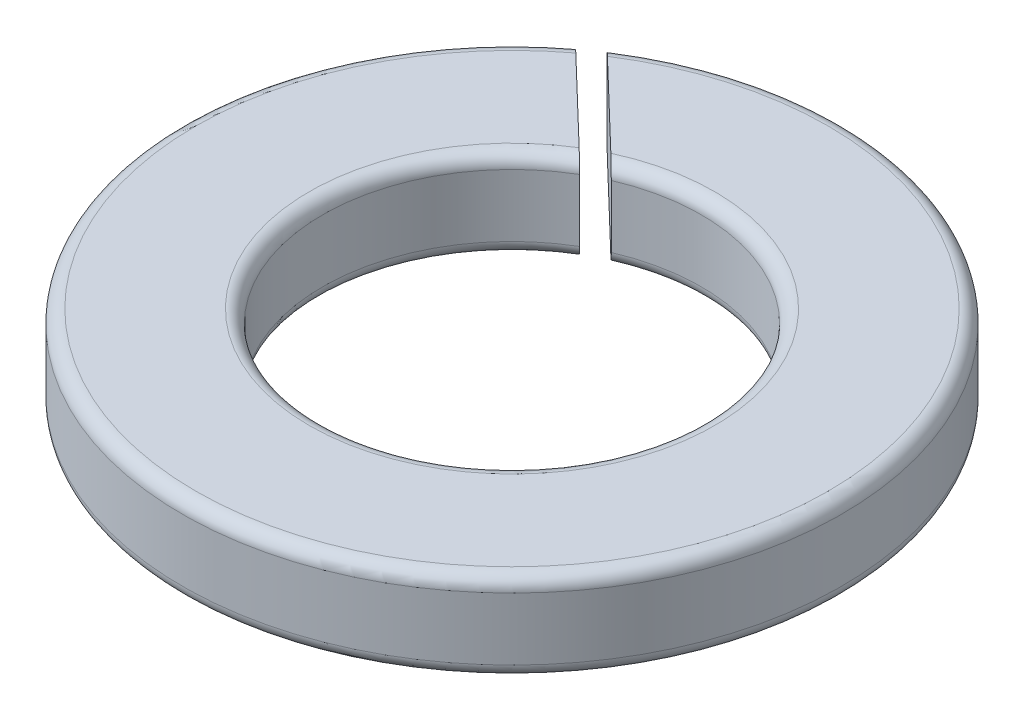
ISO-10303-21;
HEADER;
FILE_DESCRIPTION(('STEP AP214'),'2;1');
FILE_NAME('part.step','',(''),(''),'','','');
FILE_SCHEMA(('AUTOMOTIVE_DESIGN { 1 0 10303 214 1 1 1 1 }'));
ENDSEC;
DATA;
#1=APPLICATION_CONTEXT('core data for automotive mechanical design processes');
#2=APPLICATION_PROTOCOL_DEFINITION('international standard','automotive_design',2000,#1);
#3=PRODUCT_CONTEXT('',#1,'mechanical');
#4=PRODUCT('Part','Part','',(#3));
#5=PRODUCT_RELATED_PRODUCT_CATEGORY('part','',(#4));
#6=PRODUCT_DEFINITION_FORMATION('','',#4);
#7=PRODUCT_DEFINITION_CONTEXT('part definition',#1,'design');
#8=PRODUCT_DEFINITION('design','',#6,#7);
#9=PRODUCT_DEFINITION_SHAPE('','',#8);
#10=(LENGTH_UNIT() NAMED_UNIT(*) SI_UNIT(.MILLI.,.METRE.));
#11=(NAMED_UNIT(*) PLANE_ANGLE_UNIT() SI_UNIT($,.RADIAN.));
#12=(NAMED_UNIT(*) SI_UNIT($,.STERADIAN.) SOLID_ANGLE_UNIT());
#13=UNCERTAINTY_MEASURE_WITH_UNIT(LENGTH_MEASURE(1.E-05),#10,'distance_accuracy_value','');
#14=(GEOMETRIC_REPRESENTATION_CONTEXT(3) GLOBAL_UNCERTAINTY_ASSIGNED_CONTEXT((#13)) GLOBAL_UNIT_ASSIGNED_CONTEXT((#10,
#11,#12)) REPRESENTATION_CONTEXT('',''));
#15=CARTESIAN_POINT('',(0.,0.,0.));
#16=DIRECTION('',(0.,0.,1.));
#17=DIRECTION('',(1.,0.,0.));
#18=AXIS2_PLACEMENT_3D('',#15,#16,#17);
#19=CARTESIAN_POINT('',(-0.661624244853836,0.,-2.23760962036316));
#20=DIRECTION('',(-0.692531828189713,0.,0.721387321030952));
#21=DIRECTION('',(0.,1.,0.));
#22=AXIS2_PLACEMENT_3D('',#19,#20,#21);
#23=PLANE('',#22);
#24=CARTESIAN_POINT('',(-2.14974793991593,0.3,-3.66620836762277));
#25=CARTESIAN_POINT('',(-2.14974793991593,0.240629744396419,-3.66620836762277));
#26=CARTESIAN_POINT('',(-2.16771760077173,0.183252204723142,-3.68345924204434));
#27=CARTESIAN_POINT('',(-2.18484213299696,0.12857318017034,-3.69989879298056));
#28=CARTESIAN_POINT('',(-2.21698518834885,0.0859872546971304,-3.73075612611838));
#29=CARTESIAN_POINT('',(-2.24732805039414,0.0457863824540221,-3.75988527368186));
#30=CARTESIAN_POINT('',(-2.28957208314374,0.0224536410828525,-3.80043954512147));
#31=CARTESIAN_POINT('',(-2.33022450088424,0.,-3.83946586615235));
#32=CARTESIAN_POINT('',(-2.37405382532051,0.,-3.88154201761117));
#33=B_SPLINE_CURVE_WITH_KNOTS('',2,(#24,#25,#26,#27,#28,#29,#30,#31,#32),.UNSPECIFIED.,.F.,.F.,
(3,2,2,2,3),(0.,0.25,0.5,0.75,1.),.UNSPECIFIED.);
#34=CARTESIAN_POINT('',(-2.14974793991593,0.3,-3.66620836762277));
#35=VERTEX_POINT('',#34);
#36=CARTESIAN_POINT('',(-2.37405382532051,0.,-3.88154201761118));
#37=VERTEX_POINT('',#36);
#38=EDGE_CURVE('E309',#35,#37,#33,.T.);
#39=ORIENTED_EDGE('',*,*,#38,.T.);
#40=DIRECTION('',(0.721387321030952,0.,0.692531828189713));
#41=VECTOR('',#40,1.);
#42=CARTESIAN_POINT('',(-0.661624244853836,0.,-2.23760962036316));
#43=LINE('',#42,#41);
#44=CARTESIAN_POINT('',(-4.2529490192219,0.,-5.6852814037565));
#45=VERTEX_POINT('',#44);
#46=EDGE_CURVE('E303',#45,#37,#43,.T.);
#47=ORIENTED_EDGE('',*,*,#46,.F.);
#48=CARTESIAN_POINT('',(-4.2529490192219,0.,-5.6852814037565));
#49=CARTESIAN_POINT('',(-4.29526121182356,0.,-5.7259011086541));
#50=CARTESIAN_POINT('',(-4.33610133850634,0.0226273160428799,-5.76510763026956));
#51=CARTESIAN_POINT('',(-4.3759105991683,0.0446834847082794,-5.80332452050505));
#52=CARTESIAN_POINT('',(-4.40740555030643,0.087075453389272,-5.83355967359765));
#53=CARTESIAN_POINT('',(-4.43767923659617,0.127823608718195,-5.8626224124358));
#54=CARTESIAN_POINT('',(-4.45517975413099,0.184531862517177,-5.87942290926923));
#55=CARTESIAN_POINT('',(-4.47217105871121,0.23959007497256,-5.89573456166624));
#56=CARTESIAN_POINT('',(-4.47217105871121,0.3,-5.89573456166624));
#57=B_SPLINE_CURVE_WITH_KNOTS('',2,(#48,#49,#50,#51,#52,#53,#54,#55,#56),.UNSPECIFIED.,.F.,.F.,
(3,2,2,2,3),(0.,0.25,0.5,0.75,1.),.UNSPECIFIED.);
#58=CARTESIAN_POINT('',(-4.47217105871121,0.3,-5.89573456166624));
#59=VERTEX_POINT('',#58);
#60=EDGE_CURVE('E103',#45,#59,#57,.T.);
#61=ORIENTED_EDGE('',*,*,#60,.T.);
#62=DIRECTION('',(0.,-1.,0.));
#63=VECTOR('',#62,1.);
#64=CARTESIAN_POINT('',(-4.47217105871121,2.,-5.89573456166624));
#65=LINE('',#64,#63);
#66=CARTESIAN_POINT('',(-4.47217105871121,1.7,-5.89573456166624));
#67=VERTEX_POINT('',#66);
#68=EDGE_CURVE('E100',#67,#59,#65,.T.);
#69=ORIENTED_EDGE('',*,*,#68,.F.);
#70=CARTESIAN_POINT('',(-4.47217105871121,1.7,-5.89573456166624));
#71=CARTESIAN_POINT('',(-4.47217105871121,1.75888836685202,-5.89573456166624));
#72=CARTESIAN_POINT('',(-4.45501531386632,1.81570401494163,-5.87926504661514));
#73=CARTESIAN_POINT('',(-4.43856225290837,1.87019254515904,-5.86347010809551));
#74=CARTESIAN_POINT('',(-4.407419034755,1.91290622541178,-5.83357261866828));
#75=CARTESIAN_POINT('',(-4.37785897615647,1.95344856387568,-5.80519496241369));
#76=CARTESIAN_POINT('',(-4.33629255143571,1.97713454622042,-5.76529119468176));
#77=CARTESIAN_POINT('',(-4.29616606863242,2.,-5.7267697711906));
#78=CARTESIAN_POINT('',(-4.2529490192219,2.,-5.6852814037565));
#79=B_SPLINE_CURVE_WITH_KNOTS('',2,(#70,#71,#72,#73,#74,#75,#76,#77,#78),.UNSPECIFIED.,.F.,.F.,
(3,2,2,2,3),(0.,0.25,0.5,0.75,1.),.UNSPECIFIED.);
#80=CARTESIAN_POINT('',(-4.2529490192219,2.,-5.6852814037565));
#81=VERTEX_POINT('',#80);
#82=EDGE_CURVE('E30',#67,#81,#79,.T.);
#83=ORIENTED_EDGE('',*,*,#82,.T.);
#84=DIRECTION('',(0.721387321030952,0.,0.692531828189713));
#85=VECTOR('',#84,1.);
#86=CARTESIAN_POINT('',(-0.661624244853836,2.,-2.23760962036316));
#87=LINE('',#86,#85);
#88=CARTESIAN_POINT('',(-2.37405382532051,2.,-3.88154201761118));
#89=VERTEX_POINT('',#88);
#90=EDGE_CURVE('E145',#81,#89,#87,.T.);
#91=ORIENTED_EDGE('',*,*,#90,.T.);
#92=CARTESIAN_POINT('',(-2.37405382532051,2.,-3.88154201761117));
#93=CARTESIAN_POINT('',(-2.3311338945802,2.,-3.84033888410048));
#94=CARTESIAN_POINT('',(-2.2897591998313,1.9777789265025,-3.80061917714153));
#95=CARTESIAN_POINT('',(-2.24932502666871,1.95606297816478,-3.76180237090544));
#96=CARTESIAN_POINT('',(-2.21700415172658,1.91403763266946,-3.730774330961));
#97=CARTESIAN_POINT('',(-2.18576555551307,1.87341952437218,-3.70078527859602));
#98=CARTESIAN_POINT('',(-2.1675556359625,1.81653915787183,-3.68330375582748));
#99=CARTESIAN_POINT('',(-2.14974793991593,1.76091517365579,-3.66620836762277));
#100=CARTESIAN_POINT('',(-2.14974793991593,1.7,-3.66620836762277));
#101=B_SPLINE_CURVE_WITH_KNOTS('',2,(#92,#93,#94,#95,#96,#97,#98,#99,#100),.UNSPECIFIED.,.F.,
.F.,(3,2,2,2,3),(0.,0.25,0.5,0.75,1.),.UNSPECIFIED.);
#102=CARTESIAN_POINT('',(-2.14974793991593,1.7,-3.66620836762277));
#103=VERTEX_POINT('',#102);
#104=EDGE_CURVE('E259',#89,#103,#101,.T.);
#105=ORIENTED_EDGE('',*,*,#104,.T.);
#106=DIRECTION('',(0.,-1.,0.));
#107=VECTOR('',#106,1.);
#108=CARTESIAN_POINT('',(-2.14974793991593,2.,-3.66620836762277));
#109=LINE('',#108,#107);
#110=EDGE_CURVE('E139',#103,#35,#109,.T.);
#111=ORIENTED_EDGE('',*,*,#110,.T.);
#112=EDGE_LOOP('',(#39,#47,#61,#69,#83,#91,#105,#111));
#113=FACE_BOUND('',#112,.T.);
#114=ADVANCED_FACE('F17',(#113),#23,.F.);
#115=CARTESIAN_POINT('',(-0.31535833075898,0.,-2.59830328087864));
#116=DIRECTION('',(0.692531828189713,0.,-0.721387321030952));
#117=DIRECTION('',(0.,-1.,0.));
#118=AXIS2_PLACEMENT_3D('',#115,#116,#117);
#119=PLANE('',#118);
#120=CARTESIAN_POINT('',(-1.91037822124605,0.,-4.12952237574623));
#121=CARTESIAN_POINT('',(-1.86629317711516,0.,-4.08720073338057));
#122=CARTESIAN_POINT('',(-1.82396976987927,0.0214779241112068,-4.04657026243412));
#123=CARTESIAN_POINT('',(-1.78240458222935,0.0425710733710786,-4.00666768229019));
#124=CARTESIAN_POINT('',(-1.74859467410485,0.0839295409568053,-3.97421017049068));
#125=CARTESIAN_POINT('',(-1.71559095445306,0.124301826631199,-3.94252659962496));
#126=CARTESIAN_POINT('',(-1.6960794188187,0.181487423363369,-3.92379552541597));
#127=CARTESIAN_POINT('',(-1.67676065073298,0.238108045226012,-3.90524950805368));
#128=CARTESIAN_POINT('',(-1.67676065073298,0.3,-3.90524950805368));
#129=B_SPLINE_CURVE_WITH_KNOTS('',2,(#120,#121,#122,#123,#124,#125,#126,#127,#128),
.UNSPECIFIED.,.F.,.F.,(3,2,2,2,3),(0.,0.25,0.5,0.75,1.),.UNSPECIFIED.);
#130=CARTESIAN_POINT('',(-1.91037822124605,0.,-4.12952237574623));
#131=VERTEX_POINT('',#130);
#132=CARTESIAN_POINT('',(-1.67676065073298,0.3,-3.90524950805368));
#133=VERTEX_POINT('',#132);
#134=EDGE_CURVE('E43',#131,#133,#129,.T.);
#135=ORIENTED_EDGE('',*,*,#134,.T.);
#136=DIRECTION('',(0.,1.,0.));
#137=VECTOR('',#136,1.);
#138=CARTESIAN_POINT('',(-1.67676065073298,2.,-3.90524950805368));
#139=LINE('',#138,#137);
#140=CARTESIAN_POINT('',(-1.67676065073298,1.7,-3.90524950805368));
#141=VERTEX_POINT('',#140);
#142=EDGE_CURVE('E233',#133,#141,#139,.T.);
#143=ORIENTED_EDGE('',*,*,#142,.T.);
#144=CARTESIAN_POINT('',(-1.67676065073298,1.7,-3.90524950805368));
#145=CARTESIAN_POINT('',(-1.67676065073298,1.76030228343196,-3.90524950805368));
#146=CARTESIAN_POINT('',(-1.69621334432653,1.81863176825187,-3.92392409390349));
#147=CARTESIAN_POINT('',(-1.71455804912213,1.87363891545004,-3.94153501050727));
#148=CARTESIAN_POINT('',(-1.74854871344237,1.91601371539799,-3.97416604825469));
#149=CARTESIAN_POINT('',(-1.78032606968276,1.95562927280149,-4.00467231024547));
#150=CARTESIAN_POINT('',(-1.82379368675587,1.97831106674915,-4.04640122263566));
#151=CARTESIAN_POINT('',(-1.86535857564641,2.,-4.08630351597057));
#152=CARTESIAN_POINT('',(-1.91037822124605,2.,-4.12952237574623));
#153=B_SPLINE_CURVE_WITH_KNOTS('',2,(#144,#145,#146,#147,#148,#149,#150,#151,#152),
.UNSPECIFIED.,.F.,.F.,(3,2,2,2,3),(0.,0.25,0.5,0.75,1.),.UNSPECIFIED.);
#154=CARTESIAN_POINT('',(-1.91037822124605,2.,-4.12952237574623));
#155=VERTEX_POINT('',#154);
#156=EDGE_CURVE('E229',#141,#155,#153,.T.);
#157=ORIENTED_EDGE('',*,*,#156,.T.);
#158=DIRECTION('',(-0.721387321030952,0.,-0.692531828189713));
#159=VECTOR('',#158,1.);
#160=CARTESIAN_POINT('',(-0.31535833075898,2.,-2.59830328087864));
#161=LINE('',#160,#159);
#162=CARTESIAN_POINT('',(-3.83376418818276,2.,-5.97597290400546));
#163=VERTEX_POINT('',#162);
#164=EDGE_CURVE('E144',#155,#163,#161,.T.);
#165=ORIENTED_EDGE('',*,*,#164,.T.);
#166=CARTESIAN_POINT('',(-3.83376418818275,2.,-5.97597290400546));
#167=CARTESIAN_POINT('',(-3.8764840522163,2.,-6.01698397347766));
#168=CARTESIAN_POINT('',(-3.91763519484479,1.97767327531661,-6.05648907040102));
#169=CARTESIAN_POINT('',(-3.95785441652761,1.95585216824313,-6.09509952321652));
#170=CARTESIAN_POINT('',(-3.98983871891449,1.91369212072243,-6.12580445350792));
#171=CARTESIAN_POINT('',(-4.02068805498558,1.873028126898,-6.15541981613617));
#172=CARTESIAN_POINT('',(-4.03860401344486,1.81615995300395,-6.17261913625708));
#173=CARTESIAN_POINT('',(-4.05605955351713,1.76075322215551,-6.18937645472646));
#174=CARTESIAN_POINT('',(-4.05605955351713,1.7,-6.18937645472646));
#175=B_SPLINE_CURVE_WITH_KNOTS('',2,(#166,#167,#168,#169,#170,#171,#172,#173,#174),
.UNSPECIFIED.,.F.,.F.,(3,2,2,2,3),(0.,0.25,0.5,0.75,1.),.UNSPECIFIED.);
#176=CARTESIAN_POINT('',(-4.05605955351714,1.7,-6.18937645472647));
#177=VERTEX_POINT('',#176);
#178=EDGE_CURVE('E11',#163,#177,#175,.T.);
#179=ORIENTED_EDGE('',*,*,#178,.T.);
#180=DIRECTION('',(0.,1.,0.));
#181=VECTOR('',#180,1.);
#182=CARTESIAN_POINT('',(-4.05605955351714,2.,-6.18937645472647));
#183=LINE('',#182,#181);
#184=CARTESIAN_POINT('',(-4.05605955351714,0.3,-6.18937645472647));
#185=VERTEX_POINT('',#184);
#186=EDGE_CURVE('E114',#185,#177,#183,.T.);
#187=ORIENTED_EDGE('',*,*,#186,.F.);
#188=CARTESIAN_POINT('',(-4.05605955351713,0.3,-6.18937645472646));
#189=CARTESIAN_POINT('',(-4.05605955351713,0.240787207253616,-6.18937645472646));
#190=CARTESIAN_POINT('',(-4.03844162480569,0.183623772538329,-6.17246324316348));
#191=CARTESIAN_POINT('',(-4.02159718930504,0.128970027207184,-6.15629258508286));
#192=CARTESIAN_POINT('',(-3.98986385378661,0.0863413239734588,-6.12582858298516));
#193=CARTESIAN_POINT('',(-3.95984696192599,0.0460183905590878,-6.09701236679896));
#194=CARTESIAN_POINT('',(-3.9178297886047,0.0225696595286568,-6.05667588041053));
#195=CARTESIAN_POINT('',(-3.87738780072113,0.,-6.0178515720423));
#196=CARTESIAN_POINT('',(-3.83376418818275,0.,-5.97597290400546));
#197=B_SPLINE_CURVE_WITH_KNOTS('',2,(#188,#189,#190,#191,#192,#193,#194,#195,#196),
.UNSPECIFIED.,.F.,.F.,(3,2,2,2,3),(0.,0.25,0.5,0.75,1.),.UNSPECIFIED.);
#198=CARTESIAN_POINT('',(-3.83376418818276,0.,-5.97597290400546));
#199=VERTEX_POINT('',#198);
#200=EDGE_CURVE('E96',#185,#199,#197,.T.);
#201=ORIENTED_EDGE('',*,*,#200,.T.);
#202=DIRECTION('',(-0.721387321030952,0.,-0.692531828189713));
#203=VECTOR('',#202,1.);
#204=CARTESIAN_POINT('',(-0.31535833075898,0.,-2.59830328087864));
#205=LINE('',#204,#203);
#206=EDGE_CURVE('E116',#131,#199,#205,.T.);
#207=ORIENTED_EDGE('',*,*,#206,.F.);
#208=EDGE_LOOP('',(#135,#143,#157,#165,#179,#187,#201,#207));
#209=FACE_BOUND('',#208,.T.);
#210=ADVANCED_FACE('F166',(#209),#119,.F.);
#211=CARTESIAN_POINT('',(0.,1.7,0.));
#212=DIRECTION('',(0.,1.,0.));
#213=DIRECTION('',(0.,0.,1.));
#214=AXIS2_PLACEMENT_3D('',#211,#212,#213);
#215=TOROIDAL_SURFACE('',#214,7.1,0.3);
#216=ORIENTED_EDGE('',*,*,#82,.F.);
#217=CARTESIAN_POINT('',(0.,1.7,0.));
#218=DIRECTION('',(0.,-1.,0.));
#219=DIRECTION('',(0.,0.,1.));
#220=AXIS2_PLACEMENT_3D('',#217,#218,#219);
#221=CIRCLE('',#220,7.4);
#222=EDGE_CURVE('E87',#177,#67,#221,.T.);
#223=ORIENTED_EDGE('',*,*,#222,.F.);
#224=ORIENTED_EDGE('',*,*,#178,.F.);
#225=CARTESIAN_POINT('',(0.,2.,0.));
#226=DIRECTION('',(0.,1.,0.));
#227=DIRECTION('',(0.,0.,1.));
#228=AXIS2_PLACEMENT_3D('',#225,#226,#227);
#229=CIRCLE('',#228,7.1);
#230=EDGE_CURVE('E90',#81,#163,#229,.T.);
#231=ORIENTED_EDGE('',*,*,#230,.F.);
#232=EDGE_LOOP('',(#216,#223,#224,#231));
#233=FACE_BOUND('',#232,.T.);
#234=ADVANCED_FACE('F84',(#233),#215,.T.);
#235=CARTESIAN_POINT('',(0.,0.3,0.));
#236=DIRECTION('',(0.,1.,0.));
#237=DIRECTION('',(0.,0.,1.));
#238=AXIS2_PLACEMENT_3D('',#235,#236,#237);
#239=TOROIDAL_SURFACE('',#238,7.1,0.3);
#240=ORIENTED_EDGE('',*,*,#60,.F.);
#241=CARTESIAN_POINT('',(0.,0.,0.));
#242=DIRECTION('',(0.,-1.,0.));
#243=DIRECTION('',(0.,0.,1.));
#244=AXIS2_PLACEMENT_3D('',#241,#242,#243);
#245=CIRCLE('',#244,7.1);
#246=EDGE_CURVE('E253',#199,#45,#245,.T.);
#247=ORIENTED_EDGE('',*,*,#246,.F.);
#248=ORIENTED_EDGE('',*,*,#200,.F.);
#249=CARTESIAN_POINT('',(0.,0.3,0.));
#250=DIRECTION('',(0.,1.,0.));
#251=DIRECTION('',(0.,0.,1.));
#252=AXIS2_PLACEMENT_3D('',#249,#250,#251);
#253=CIRCLE('',#252,7.4);
#254=EDGE_CURVE('E109',#59,#185,#253,.T.);
#255=ORIENTED_EDGE('',*,*,#254,.F.);
#256=EDGE_LOOP('',(#240,#247,#248,#255));
#257=FACE_BOUND('',#256,.T.);
#258=ADVANCED_FACE('F165',(#257),#239,.T.);
#259=CARTESIAN_POINT('',(0.,1.7,0.));
#260=DIRECTION('',(0.,1.,0.));
#261=DIRECTION('',(0.,0.,1.));
#262=AXIS2_PLACEMENT_3D('',#259,#260,#261);
#263=TOROIDAL_SURFACE('',#262,4.55,0.3);
#264=ORIENTED_EDGE('',*,*,#104,.F.);
#265=CARTESIAN_POINT('',(0.,2.,0.));
#266=DIRECTION('',(0.,-1.,0.));
#267=DIRECTION('',(0.,0.,1.));
#268=AXIS2_PLACEMENT_3D('',#265,#266,#267);
#269=CIRCLE('',#268,4.55);
#270=EDGE_CURVE('E151',#155,#89,#269,.T.);
#271=ORIENTED_EDGE('',*,*,#270,.F.);
#272=ORIENTED_EDGE('',*,*,#156,.F.);
#273=CARTESIAN_POINT('',(0.,1.7,0.));
#274=DIRECTION('',(0.,1.,0.));
#275=DIRECTION('',(0.,0.,1.));
#276=AXIS2_PLACEMENT_3D('',#273,#274,#275);
#277=CIRCLE('',#276,4.25);
#278=EDGE_CURVE('E242',#103,#141,#277,.T.);
#279=ORIENTED_EDGE('',*,*,#278,.F.);
#280=EDGE_LOOP('',(#264,#271,#272,#279));
#281=FACE_BOUND('',#280,.T.);
#282=ADVANCED_FACE('F170',(#281),#263,.T.);
#283=CARTESIAN_POINT('',(0.,0.3,0.));
#284=DIRECTION('',(0.,1.,0.));
#285=DIRECTION('',(0.,0.,1.));
#286=AXIS2_PLACEMENT_3D('',#283,#284,#285);
#287=TOROIDAL_SURFACE('',#286,4.55,0.3);
#288=ORIENTED_EDGE('',*,*,#38,.F.);
#289=CARTESIAN_POINT('',(0.,0.3,0.));
#290=DIRECTION('',(0.,-1.,0.));
#291=DIRECTION('',(0.,0.,1.));
#292=AXIS2_PLACEMENT_3D('',#289,#290,#291);
#293=CIRCLE('',#292,4.25);
#294=EDGE_CURVE('E241',#133,#35,#293,.T.);
#295=ORIENTED_EDGE('',*,*,#294,.F.);
#296=ORIENTED_EDGE('',*,*,#134,.F.);
#297=CARTESIAN_POINT('',(0.,0.,0.));
#298=DIRECTION('',(0.,1.,0.));
#299=DIRECTION('',(0.,0.,1.));
#300=AXIS2_PLACEMENT_3D('',#297,#298,#299);
#301=CIRCLE('',#300,4.55);
#302=EDGE_CURVE('E123',#37,#131,#301,.T.);
#303=ORIENTED_EDGE('',*,*,#302,.F.);
#304=EDGE_LOOP('',(#288,#295,#296,#303));
#305=FACE_BOUND('',#304,.T.);
#306=ADVANCED_FACE('F167',(#305),#287,.T.);
#307=CARTESIAN_POINT('',(0.,2.,0.));
#308=DIRECTION('',(0.,-1.,0.));
#309=DIRECTION('',(0.,0.,-1.));
#310=AXIS2_PLACEMENT_3D('',#307,#308,#309);
#311=CYLINDRICAL_SURFACE('',#310,4.25);
#312=ORIENTED_EDGE('',*,*,#110,.F.);
#313=ORIENTED_EDGE('',*,*,#278,.T.);
#314=ORIENTED_EDGE('',*,*,#142,.F.);
#315=ORIENTED_EDGE('',*,*,#294,.T.);
#316=EDGE_LOOP('',(#312,#313,#314,#315));
#317=FACE_BOUND('',#316,.T.);
#318=ADVANCED_FACE('F325',(#317),#311,.F.);
#319=CARTESIAN_POINT('',(0.,2.,0.));
#320=DIRECTION('',(0.,-1.,0.));
#321=DIRECTION('',(0.,0.,-1.));
#322=AXIS2_PLACEMENT_3D('',#319,#320,#321);
#323=CYLINDRICAL_SURFACE('',#322,7.4);
#324=ORIENTED_EDGE('',*,*,#222,.T.);
#325=ORIENTED_EDGE('',*,*,#68,.T.);
#326=ORIENTED_EDGE('',*,*,#254,.T.);
#327=ORIENTED_EDGE('',*,*,#186,.T.);
#328=EDGE_LOOP('',(#324,#325,#326,#327));
#329=FACE_BOUND('',#328,.T.);
#330=ADVANCED_FACE('F112',(#329),#323,.T.);
#331=CARTESIAN_POINT('',(0.,0.,0.));
#332=DIRECTION('',(0.,1.,0.));
#333=DIRECTION('',(1.,0.,0.));
#334=AXIS2_PLACEMENT_3D('',#331,#332,#333);
#335=PLANE('',#334);
#336=ORIENTED_EDGE('',*,*,#246,.T.);
#337=ORIENTED_EDGE('',*,*,#46,.T.);
#338=ORIENTED_EDGE('',*,*,#302,.T.);
#339=ORIENTED_EDGE('',*,*,#206,.T.);
#340=EDGE_LOOP('',(#336,#337,#338,#339));
#341=FACE_BOUND('',#340,.T.);
#342=ADVANCED_FACE('F204',(#341),#335,.F.);
#343=CARTESIAN_POINT('',(0.,2.,0.));
#344=DIRECTION('',(0.,1.,0.));
#345=DIRECTION('',(1.,0.,0.));
#346=AXIS2_PLACEMENT_3D('',#343,#344,#345);
#347=PLANE('',#346);
#348=ORIENTED_EDGE('',*,*,#90,.F.);
#349=ORIENTED_EDGE('',*,*,#230,.T.);
#350=ORIENTED_EDGE('',*,*,#164,.F.);
#351=ORIENTED_EDGE('',*,*,#270,.T.);
#352=EDGE_LOOP('',(#348,#349,#350,#351));
#353=FACE_BOUND('',#352,.T.);
#354=ADVANCED_FACE('F332',(#353),#347,.T.);
#355=CLOSED_SHELL('',(#114,#210,#234,#258,#282,#306,#318,#330,#342,#354));
#356=MANIFOLD_SOLID_BREP('B1',#355);
#357=ADVANCED_BREP_SHAPE_REPRESENTATION('',(#18,#356),#14);
#358=SHAPE_DEFINITION_REPRESENTATION(#9,#357);
ENDSEC;
END-ISO-10303-21;
